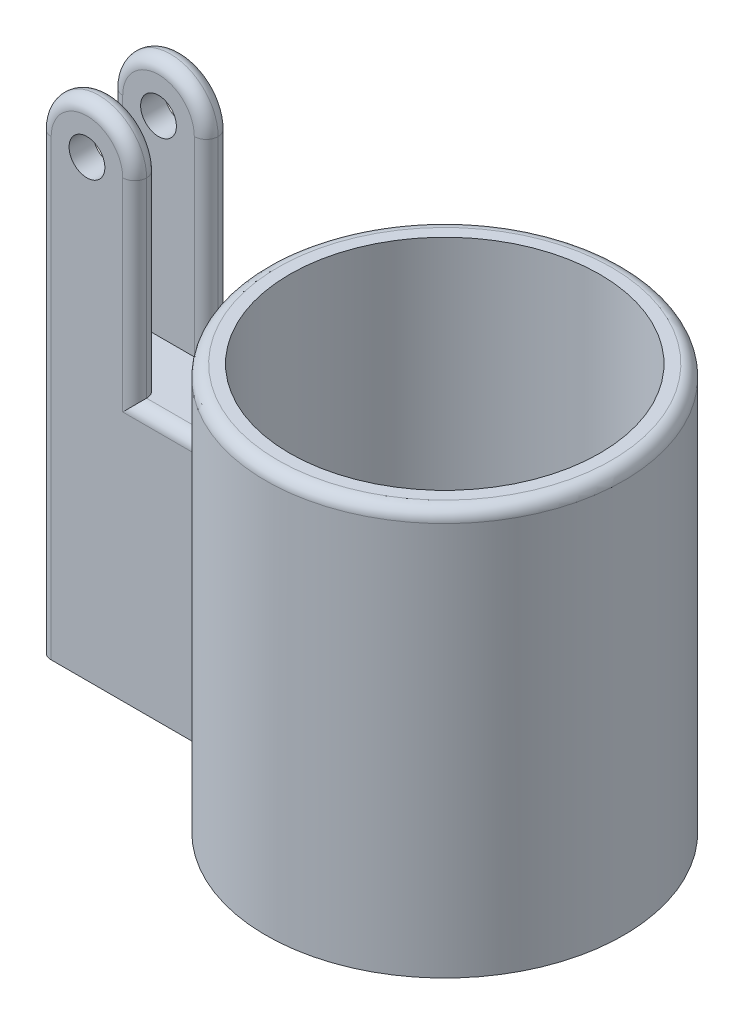
ISO-10303-21;
HEADER;
FILE_DESCRIPTION(('STEP AP214'),'2;1');
FILE_NAME('part.step','',(''),(''),'','','');
FILE_SCHEMA(('AUTOMOTIVE_DESIGN { 1 0 10303 214 1 1 1 1 }'));
ENDSEC;
DATA;
#1=APPLICATION_CONTEXT('core data for automotive mechanical design processes');
#2=APPLICATION_PROTOCOL_DEFINITION('international standard','automotive_design',2000,#1);
#3=PRODUCT_CONTEXT('',#1,'mechanical');
#4=PRODUCT('Part','Part','',(#3));
#5=PRODUCT_RELATED_PRODUCT_CATEGORY('part','',(#4));
#6=PRODUCT_DEFINITION_FORMATION('','',#4);
#7=PRODUCT_DEFINITION_CONTEXT('part definition',#1,'design');
#8=PRODUCT_DEFINITION('design','',#6,#7);
#9=PRODUCT_DEFINITION_SHAPE('','',#8);
#10=(LENGTH_UNIT() NAMED_UNIT(*) SI_UNIT(.MILLI.,.METRE.));
#11=(NAMED_UNIT(*) PLANE_ANGLE_UNIT() SI_UNIT($,.RADIAN.));
#12=(NAMED_UNIT(*) SI_UNIT($,.STERADIAN.) SOLID_ANGLE_UNIT());
#13=UNCERTAINTY_MEASURE_WITH_UNIT(LENGTH_MEASURE(1.E-05),#10,'distance_accuracy_value','');
#14=(GEOMETRIC_REPRESENTATION_CONTEXT(3) GLOBAL_UNCERTAINTY_ASSIGNED_CONTEXT((#13)) GLOBAL_UNIT_ASSIGNED_CONTEXT((#10,
#11,#12)) REPRESENTATION_CONTEXT('',''));
#15=CARTESIAN_POINT('',(0.,0.,0.));
#16=DIRECTION('',(0.,0.,1.));
#17=DIRECTION('',(1.,0.,0.));
#18=AXIS2_PLACEMENT_3D('',#15,#16,#17);
#19=CARTESIAN_POINT('',(-15.,-1.,2.));
#20=DIRECTION('',(0.,0.,-1.));
#21=DIRECTION('',(-1.,0.,0.));
#22=AXIS2_PLACEMENT_3D('',#19,#20,#21);
#23=PLANE('',#22);
#24=DIRECTION('',(0.,1.,0.));
#25=VECTOR('',#24,1.);
#26=CARTESIAN_POINT('',(-7.22841614740048,-1.,2.));
#27=LINE('',#26,#25);
#28=CARTESIAN_POINT('',(-7.22841614740048,-1.,2.));
#29=VERTEX_POINT('',#28);
#30=CARTESIAN_POINT('',(-7.22841614740048,9.5,2.));
#31=VERTEX_POINT('',#30);
#32=EDGE_CURVE('E227',#29,#31,#27,.T.);
#33=ORIENTED_EDGE('',*,*,#32,.T.);
#34=DIRECTION('',(1.,0.,0.));
#35=VECTOR('',#34,1.);
#36=CARTESIAN_POINT('',(-11.5,9.5,2.));
#37=LINE('',#36,#35);
#38=CARTESIAN_POINT('',(-11.5,9.5,2.));
#39=VERTEX_POINT('',#38);
#40=EDGE_CURVE('E357',#31,#39,#37,.F.);
#41=ORIENTED_EDGE('',*,*,#40,.T.);
#42=DIRECTION('',(0.,-1.,0.));
#43=VECTOR('',#42,1.);
#44=CARTESIAN_POINT('',(-11.5,18.,2.));
#45=LINE('',#44,#43);
#46=CARTESIAN_POINT('',(-11.5,18.,2.));
#47=VERTEX_POINT('',#46);
#48=EDGE_CURVE('E100',#39,#47,#45,.F.);
#49=ORIENTED_EDGE('',*,*,#48,.T.);
#50=CARTESIAN_POINT('',(-13.,18.,2.));
#51=DIRECTION('',(0.,0.,-1.));
#52=DIRECTION('',(-1.,0.,0.));
#53=AXIS2_PLACEMENT_3D('',#50,#51,#52);
#54=CIRCLE('',#53,1.5);
#55=CARTESIAN_POINT('',(-14.5,18.,2.));
#56=VERTEX_POINT('',#55);
#57=EDGE_CURVE('E290',#47,#56,#54,.F.);
#58=ORIENTED_EDGE('',*,*,#57,.T.);
#59=DIRECTION('',(0.,1.,0.));
#60=VECTOR('',#59,1.);
#61=CARTESIAN_POINT('',(-14.5,-1.,2.));
#62=LINE('',#61,#60);
#63=CARTESIAN_POINT('',(-14.5,-1.,2.));
#64=VERTEX_POINT('',#63);
#65=EDGE_CURVE('E292',#56,#64,#62,.F.);
#66=ORIENTED_EDGE('',*,*,#65,.T.);
#67=DIRECTION('',(-1.,0.,0.));
#68=VECTOR('',#67,1.);
#69=CARTESIAN_POINT('',(-15.,-1.,2.));
#70=LINE('',#69,#68);
#71=EDGE_CURVE('E233',#29,#64,#70,.T.);
#72=ORIENTED_EDGE('',*,*,#71,.F.);
#73=EDGE_LOOP('',(#33,#41,#49,#58,#66,#72));
#74=FACE_BOUND('',#73,.T.);
#75=CARTESIAN_POINT('',(-13.,18.,2.));
#76=DIRECTION('',(0.,0.,1.));
#77=DIRECTION('',(1.,0.,0.));
#78=AXIS2_PLACEMENT_3D('',#75,#76,#77);
#79=CIRCLE('',#78,0.75);
#80=CARTESIAN_POINT('',(-12.25,18.,2.));
#81=VERTEX_POINT('',#80);
#82=EDGE_CURVE('E255',#81,#81,#79,.T.);
#83=ORIENTED_EDGE('',*,*,#82,.F.);
#84=EDGE_LOOP('',(#83));
#85=FACE_BOUND('',#84,.T.);
#86=ADVANCED_FACE('F77',(#74,#85),#23,.F.);
#87=CARTESIAN_POINT('',(0.,20.,-0.999999999999998));
#88=DIRECTION('',(0.,0.,-1.));
#89=DIRECTION('',(-1.,0.,0.));
#90=AXIS2_PLACEMENT_3D('',#87,#88,#89);
#91=PLANE('',#90);
#92=CARTESIAN_POINT('',(-13.,18.,-0.999999999999997));
#93=DIRECTION('',(0.,0.,-1.));
#94=DIRECTION('',(-1.,0.,0.));
#95=AXIS2_PLACEMENT_3D('',#92,#93,#94);
#96=CIRCLE('',#95,0.75);
#97=CARTESIAN_POINT('',(-13.75,18.,-0.999999999999997));
#98=VERTEX_POINT('',#97);
#99=EDGE_CURVE('E250',#98,#98,#96,.T.);
#100=ORIENTED_EDGE('',*,*,#99,.T.);
#101=EDGE_LOOP('',(#100));
#102=FACE_BOUND('',#101,.T.);
#103=CARTESIAN_POINT('',(-13.,18.,-0.999999999999998));
#104=DIRECTION('',(0.,0.,-1.));
#105=DIRECTION('',(-1.,0.,0.));
#106=AXIS2_PLACEMENT_3D('',#103,#104,#105);
#107=CIRCLE('',#106,1.5);
#108=CARTESIAN_POINT('',(-11.5,18.,-0.999999999999998));
#109=VERTEX_POINT('',#108);
#110=CARTESIAN_POINT('',(-14.5,18.,-0.999999999999998));
#111=VERTEX_POINT('',#110);
#112=EDGE_CURVE('E276',#109,#111,#107,.F.);
#113=ORIENTED_EDGE('',*,*,#112,.T.);
#114=DIRECTION('',(0.,-1.,0.));
#115=VECTOR('',#114,1.);
#116=CARTESIAN_POINT('',(-14.5,20.,-0.999999999999998));
#117=LINE('',#116,#115);
#118=CARTESIAN_POINT('',(-14.5,10.,-0.999999999999998));
#119=VERTEX_POINT('',#118);
#120=EDGE_CURVE('E280',#111,#119,#117,.T.);
#121=ORIENTED_EDGE('',*,*,#120,.T.);
#122=DIRECTION('',(-1.,0.,0.));
#123=VECTOR('',#122,1.);
#124=CARTESIAN_POINT('',(0.,10.,-0.999999999999998));
#125=LINE('',#124,#123);
#126=CARTESIAN_POINT('',(-11.5,10.,-0.999999999999998));
#127=VERTEX_POINT('',#126);
#128=EDGE_CURVE('E249',#127,#119,#125,.T.);
#129=ORIENTED_EDGE('',*,*,#128,.F.);
#130=DIRECTION('',(0.,-1.,0.));
#131=VECTOR('',#130,1.);
#132=CARTESIAN_POINT('',(-11.5,18.,-0.999999999999998));
#133=LINE('',#132,#131);
#134=EDGE_CURVE('E278',#127,#109,#133,.F.);
#135=ORIENTED_EDGE('',*,*,#134,.T.);
#136=EDGE_LOOP('',(#113,#121,#129,#135));
#137=FACE_BOUND('',#136,.T.);
#138=ADVANCED_FACE('F420',(#102,#137),#91,.F.);
#139=CARTESIAN_POINT('',(0.,20.,-2.));
#140=DIRECTION('',(0.,0.,-1.));
#141=DIRECTION('',(-1.,0.,0.));
#142=AXIS2_PLACEMENT_3D('',#139,#140,#141);
#143=PLANE('',#142);
#144=DIRECTION('',(1.,0.,0.));
#145=VECTOR('',#144,1.);
#146=CARTESIAN_POINT('',(0.,0.,-2.));
#147=LINE('',#146,#145);
#148=CARTESIAN_POINT('',(-14.5,0.,-2.));
#149=VERTEX_POINT('',#148);
#150=CARTESIAN_POINT('',(-11.5,0.,-2.));
#151=VERTEX_POINT('',#150);
#152=EDGE_CURVE('E241',#149,#151,#147,.T.);
#153=ORIENTED_EDGE('',*,*,#152,.F.);
#154=DIRECTION('',(0.,-1.,0.));
#155=VECTOR('',#154,1.);
#156=CARTESIAN_POINT('',(-14.5,18.,-2.));
#157=LINE('',#156,#155);
#158=CARTESIAN_POINT('',(-14.5,18.,-2.));
#159=VERTEX_POINT('',#158);
#160=EDGE_CURVE('E274',#149,#159,#157,.F.);
#161=ORIENTED_EDGE('',*,*,#160,.T.);
#162=CARTESIAN_POINT('',(-13.,18.,-2.));
#163=DIRECTION('',(0.,0.,-1.));
#164=DIRECTION('',(-1.,0.,0.));
#165=AXIS2_PLACEMENT_3D('',#162,#163,#164);
#166=CIRCLE('',#165,1.5);
#167=CARTESIAN_POINT('',(-11.5,18.,-2.));
#168=VERTEX_POINT('',#167);
#169=EDGE_CURVE('E270',#159,#168,#166,.T.);
#170=ORIENTED_EDGE('',*,*,#169,.T.);
#171=DIRECTION('',(0.,-1.,0.));
#172=VECTOR('',#171,1.);
#173=CARTESIAN_POINT('',(-11.5,20.,-2.));
#174=LINE('',#173,#172);
#175=EDGE_CURVE('E272',#168,#151,#174,.T.);
#176=ORIENTED_EDGE('',*,*,#175,.T.);
#177=EDGE_LOOP('',(#153,#161,#170,#176));
#178=FACE_BOUND('',#177,.T.);
#179=CARTESIAN_POINT('',(-13.,18.,-2.));
#180=DIRECTION('',(0.,0.,-1.));
#181=DIRECTION('',(-1.,0.,0.));
#182=AXIS2_PLACEMENT_3D('',#179,#180,#181);
#183=CIRCLE('',#182,0.75);
#184=CARTESIAN_POINT('',(-13.75,18.,-2.));
#185=VERTEX_POINT('',#184);
#186=EDGE_CURVE('E254',#185,#185,#183,.T.);
#187=ORIENTED_EDGE('',*,*,#186,.F.);
#188=EDGE_LOOP('',(#187));
#189=FACE_BOUND('',#188,.T.);
#190=ADVANCED_FACE('F426',(#178,#189),#143,.T.);
#191=CARTESIAN_POINT('',(0.,20.,1.));
#192=DIRECTION('',(0.,0.,1.));
#193=DIRECTION('',(1.,0.,0.));
#194=AXIS2_PLACEMENT_3D('',#191,#192,#193);
#195=PLANE('',#194);
#196=CARTESIAN_POINT('',(-13.,18.,1.));
#197=DIRECTION('',(0.,0.,1.));
#198=DIRECTION('',(1.,0.,0.));
#199=AXIS2_PLACEMENT_3D('',#196,#197,#198);
#200=CIRCLE('',#199,0.75);
#201=CARTESIAN_POINT('',(-12.25,18.,1.));
#202=VERTEX_POINT('',#201);
#203=EDGE_CURVE('E251',#202,#202,#200,.T.);
#204=ORIENTED_EDGE('',*,*,#203,.T.);
#205=EDGE_LOOP('',(#204));
#206=FACE_BOUND('',#205,.T.);
#207=CARTESIAN_POINT('',(-13.,18.,1.));
#208=DIRECTION('',(0.,0.,1.));
#209=DIRECTION('',(1.,0.,0.));
#210=AXIS2_PLACEMENT_3D('',#207,#208,#209);
#211=CIRCLE('',#210,1.5);
#212=CARTESIAN_POINT('',(-14.5,18.,1.));
#213=VERTEX_POINT('',#212);
#214=CARTESIAN_POINT('',(-11.5,18.,1.));
#215=VERTEX_POINT('',#214);
#216=EDGE_CURVE('E283',#213,#215,#211,.F.);
#217=ORIENTED_EDGE('',*,*,#216,.T.);
#218=DIRECTION('',(0.,-1.,0.));
#219=VECTOR('',#218,1.);
#220=CARTESIAN_POINT('',(-11.5,10.,1.));
#221=LINE('',#220,#219);
#222=CARTESIAN_POINT('',(-11.5,10.,1.));
#223=VERTEX_POINT('',#222);
#224=EDGE_CURVE('E287',#215,#223,#221,.T.);
#225=ORIENTED_EDGE('',*,*,#224,.T.);
#226=DIRECTION('',(1.,0.,0.));
#227=VECTOR('',#226,1.);
#228=CARTESIAN_POINT('',(0.,10.,1.));
#229=LINE('',#228,#227);
#230=CARTESIAN_POINT('',(-14.5,10.,1.));
#231=VERTEX_POINT('',#230);
#232=EDGE_CURVE('E483',#231,#223,#229,.T.);
#233=ORIENTED_EDGE('',*,*,#232,.F.);
#234=DIRECTION('',(0.,-1.,0.));
#235=VECTOR('',#234,1.);
#236=CARTESIAN_POINT('',(-14.5,20.,1.));
#237=LINE('',#236,#235);
#238=EDGE_CURVE('E285',#231,#213,#237,.F.);
#239=ORIENTED_EDGE('',*,*,#238,.T.);
#240=EDGE_LOOP('',(#217,#225,#233,#239));
#241=FACE_BOUND('',#240,.T.);
#242=ADVANCED_FACE('F440',(#206,#241),#195,.F.);
#243=CARTESIAN_POINT('',(-15.,-1.,2.));
#244=DIRECTION('',(1.,0.,0.));
#245=DIRECTION('',(0.,0.,-1.));
#246=AXIS2_PLACEMENT_3D('',#243,#244,#245);
#247=PLANE('',#246);
#248=DIRECTION('',(0.,1.,0.));
#249=VECTOR('',#248,1.);
#250=CARTESIAN_POINT('',(-15.,-1.,1.5));
#251=LINE('',#250,#249);
#252=CARTESIAN_POINT('',(-15.,-1.,1.5));
#253=VERTEX_POINT('',#252);
#254=CARTESIAN_POINT('',(-15.,9.5,1.5));
#255=VERTEX_POINT('',#254);
#256=EDGE_CURVE('E245',#253,#255,#251,.T.);
#257=ORIENTED_EDGE('',*,*,#256,.T.);
#258=DIRECTION('',(0.,0.,1.));
#259=VECTOR('',#258,1.);
#260=CARTESIAN_POINT('',(-15.,9.5,-1.5));
#261=LINE('',#260,#259);
#262=CARTESIAN_POINT('',(-15.,9.5,-1.5));
#263=VERTEX_POINT('',#262);
#264=EDGE_CURVE('E354',#255,#263,#261,.F.);
#265=ORIENTED_EDGE('',*,*,#264,.T.);
#266=DIRECTION('',(0.,-1.,0.));
#267=VECTOR('',#266,1.);
#268=CARTESIAN_POINT('',(-15.,0.,-1.5));
#269=LINE('',#268,#267);
#270=CARTESIAN_POINT('',(-15.,-1.,-1.5));
#271=VERTEX_POINT('',#270);
#272=EDGE_CURVE('E258',#263,#271,#269,.T.);
#273=ORIENTED_EDGE('',*,*,#272,.T.);
#274=DIRECTION('',(0.,0.,-1.));
#275=VECTOR('',#274,1.);
#276=CARTESIAN_POINT('',(-15.,-1.,2.));
#277=LINE('',#276,#275);
#278=EDGE_CURVE('E216',#253,#271,#277,.T.);
#279=ORIENTED_EDGE('',*,*,#278,.F.);
#280=EDGE_LOOP('',(#257,#265,#273,#279));
#281=FACE_BOUND('',#280,.T.);
#282=ADVANCED_FACE('F437',(#281),#247,.F.);
#283=CARTESIAN_POINT('',(0.,20.,0.));
#284=DIRECTION('',(0.,-1.,0.));
#285=DIRECTION('',(0.,0.,-1.));
#286=AXIS2_PLACEMENT_3D('',#283,#284,#285);
#287=CYLINDRICAL_SURFACE('',#286,7.5);
#288=CARTESIAN_POINT('',(0.,15.5,0.));
#289=DIRECTION('',(0.,-1.,0.));
#290=DIRECTION('',(0.,0.,-1.));
#291=AXIS2_PLACEMENT_3D('',#288,#289,#290);
#292=CIRCLE('',#291,7.5);
#293=CARTESIAN_POINT('',(0.,15.5,-7.5));
#294=VERTEX_POINT('',#293);
#295=EDGE_CURVE('E295',#294,#294,#292,.T.);
#296=ORIENTED_EDGE('',*,*,#295,.T.);
#297=EDGE_LOOP('',(#296));
#298=FACE_BOUND('',#297,.T.);
#299=CARTESIAN_POINT('',(0.,10.,0.));
#300=DIRECTION('',(0.,1.,0.));
#301=DIRECTION('',(0.,0.,1.));
#302=AXIS2_PLACEMENT_3D('',#299,#300,#301);
#303=CIRCLE('',#302,7.5);
#304=CARTESIAN_POINT('',(-7.34846922834953,10.,1.5));
#305=VERTEX_POINT('',#304);
#306=CARTESIAN_POINT('',(-7.35638266874421,10.,-1.46069641986273));
#307=VERTEX_POINT('',#306);
#308=EDGE_CURVE('E475',#305,#307,#303,.F.);
#309=ORIENTED_EDGE('',*,*,#308,.F.);
#310=CARTESIAN_POINT('',(-7.34846922834953,10.,1.5));
#311=CARTESIAN_POINT('',(-7.34260158815118,10.0000204172795,1.52877840285499));
#312=CARTESIAN_POINT('',(-7.33655418831696,9.99751684241223,1.5575098373988));
#313=CARTESIAN_POINT('',(-7.32431268980203,9.98765162880123,1.6140800495042));
#314=CARTESIAN_POINT('',(-7.31811866566813,9.9802924097076,1.6419192644325));
#315=CARTESIAN_POINT('',(-7.30578825199919,9.96090197371145,1.69594629144679));
#316=CARTESIAN_POINT('',(-7.29965188408316,9.94886907074739,1.72213350359452));
#317=CARTESIAN_POINT('',(-7.28768141863653,9.92045692079562,1.77210562944244));
#318=CARTESIAN_POINT('',(-7.28184726971984,9.90407841560604,1.79589095219147));
#319=CARTESIAN_POINT('',(-7.27074987429325,9.86744963242031,1.84030436159788));
#320=CARTESIAN_POINT('',(-7.26548504101553,9.84721057426438,1.8609412929956));
#321=CARTESIAN_POINT('',(-7.25576064465369,9.80336139877773,1.89850331183888));
#322=CARTESIAN_POINT('',(-7.25130115735584,9.77975096456107,1.91542804998437));
#323=CARTESIAN_POINT('',(-7.24352093771607,9.73042724895512,1.94464092872137));
#324=CARTESIAN_POINT('',(-7.24017551852059,9.70477777468493,1.9570302904944));
#325=CARTESIAN_POINT('',(-7.23466798769301,9.65164701492667,1.97729372895358));
#326=CARTESIAN_POINT('',(-7.2325045939994,9.62416775053725,1.98517269819611));
#327=CARTESIAN_POINT('',(-7.23013980010958,9.58037430852398,1.99376234444672));
#328=CARTESIAN_POINT('',(-7.22949441511994,9.56438556442295,1.99609988323275));
#329=CARTESIAN_POINT('',(-7.22863246521098,9.53226730533624,1.99921826842528));
#330=CARTESIAN_POINT('',(-7.22841532601774,9.51613800804292,2.00000119955687));
#331=CARTESIAN_POINT('',(-7.22841614740048,9.5,2.));
#332=B_SPLINE_CURVE_WITH_KNOTS('',3,(#310,#311,#312,#313,#314,#315,#316,#317,#318,#319,#320,
#321,#322,#323,#324,#325,#326,#327,#328,#329,#330,#331),.UNSPECIFIED.,.F.,.F.,(4,2,2,2,2,2,2,2,
2,2,4),(0.,0.0879905534558804,0.175937292805017,0.263915789019254,0.351879276878124,
0.439590909658535,0.527310792157074,0.612932471579488,0.698461097779793,0.746902707122689,
0.795279312395451),.UNSPECIFIED.);
#333=EDGE_CURVE('E86',#305,#31,#332,.T.);
#334=ORIENTED_EDGE('',*,*,#333,.T.);
#335=ORIENTED_EDGE('',*,*,#32,.F.);
#336=CARTESIAN_POINT('',(0.,-1.,0.));
#337=DIRECTION('',(0.,-1.,0.));
#338=DIRECTION('',(0.,0.,-1.));
#339=AXIS2_PLACEMENT_3D('',#336,#337,#338);
#340=CIRCLE('',#339,7.5);
#341=CARTESIAN_POINT('',(-7.23917602694792,-1.,-1.96069641986273));
#342=VERTEX_POINT('',#341);
#343=EDGE_CURVE('E210',#342,#29,#340,.T.);
#344=ORIENTED_EDGE('',*,*,#343,.F.);
#345=DIRECTION('',(0.,1.,0.));
#346=VECTOR('',#345,1.);
#347=CARTESIAN_POINT('',(-7.23917602694792,-1.,-1.96069641986273));
#348=LINE('',#347,#346);
#349=CARTESIAN_POINT('',(-7.23917602694792,9.5,-1.96069641986273));
#350=VERTEX_POINT('',#349);
#351=EDGE_CURVE('E219',#342,#350,#348,.T.);
#352=ORIENTED_EDGE('',*,*,#351,.T.);
#353=CARTESIAN_POINT('',(-7.23917602694792,9.5,-1.96069641986273));
#354=CARTESIAN_POINT('',(-7.23916432362115,9.52747668330952,-1.9607231467335));
#355=CARTESIAN_POINT('',(-7.23978893539414,9.55493907143122,-1.95843329507881));
#356=CARTESIAN_POINT('',(-7.24222175422741,9.60902264720567,-1.94942626244312));
#357=CARTESIAN_POINT('',(-7.24402771573558,9.63564533056132,-1.94271748095544));
#358=CARTESIAN_POINT('',(-7.24873496527142,9.68734844636092,-1.92507644728343));
#359=CARTESIAN_POINT('',(-7.2516363229489,9.712428780618,-1.9141439265353));
#360=CARTESIAN_POINT('',(-7.25837959211925,9.76038205654802,-1.88841286626802));
#361=CARTESIAN_POINT('',(-7.2622216513563,9.78325465069142,-1.87361371944194));
#362=CARTESIAN_POINT('',(-7.27073405602892,9.82658272821175,-1.84030583419795));
#363=CARTESIAN_POINT('',(-7.27541746606841,9.84699007890537,-1.82173787717084));
#364=CARTESIAN_POINT('',(-7.28535343386889,9.88442538262351,-1.78158708729993));
#365=CARTESIAN_POINT('',(-7.29060615109066,9.90145238502397,-1.76000340927207));
#366=CARTESIAN_POINT('',(-7.3016318501661,9.93218884800588,-1.71369643336603));
#367=CARTESIAN_POINT('',(-7.30741593533396,9.94577858369398,-1.6888963361508));
#368=CARTESIAN_POINT('',(-7.31912757837347,9.96858233761452,-1.63739662210629));
#369=CARTESIAN_POINT('',(-7.3250550837241,9.97779793292854,-1.6106976938924));
#370=CARTESIAN_POINT('',(-7.33527340894829,9.98977719467495,-1.5633885652755));
#371=CARTESIAN_POINT('',(-7.33958081158357,9.99360436836874,-1.54304449574445));
#372=CARTESIAN_POINT('',(-7.34808247666647,9.99871617808414,-1.50204123668613));
#373=CARTESIAN_POINT('',(-7.3522768636617,10.0000037362256,-1.481382436918));
#374=CARTESIAN_POINT('',(-7.35638266874421,10.,-1.46069641986273));
#375=B_SPLINE_CURVE_WITH_KNOTS('',3,(#353,#354,#355,#356,#357,#358,#359,#360,#361,#362,#363,
#364,#365,#366,#367,#368,#369,#370,#371,#372,#373,#374),.UNSPECIFIED.,.F.,.F.,(4,2,2,2,2,2,2,2,
2,2,4),(0.,0.0823059147960208,0.164455832398586,0.246610974311693,0.328779027587685,
0.412355028109165,0.495954498746016,0.582155453445405,0.668325305028135,0.731609882726471,
0.79482160166144),.UNSPECIFIED.);
#376=EDGE_CURVE('E449',#350,#307,#375,.T.);
#377=ORIENTED_EDGE('',*,*,#376,.T.);
#378=EDGE_LOOP('',(#309,#334,#335,#344,#352,#377));
#379=FACE_BOUND('',#378,.T.);
#380=ADVANCED_FACE('F230',(#298,#379),#287,.T.);
#381=CARTESIAN_POINT('',(0.,-1.,0.));
#382=DIRECTION('',(0.,-1.,0.));
#383=DIRECTION('',(0.,0.,-1.));
#384=AXIS2_PLACEMENT_3D('',#381,#382,#383);
#385=PLANE('',#384);
#386=ORIENTED_EDGE('',*,*,#278,.T.);
#387=CARTESIAN_POINT('',(-14.5,-1.,-1.5));
#388=DIRECTION('',(0.,-1.,0.));
#389=DIRECTION('',(0.,0.,-1.));
#390=AXIS2_PLACEMENT_3D('',#387,#388,#389);
#391=CIRCLE('',#390,0.5);
#392=CARTESIAN_POINT('',(-14.6943162595504,-1.,-1.96069641986273));
#393=VERTEX_POINT('',#392);
#394=EDGE_CURVE('E213',#271,#393,#391,.T.);
#395=ORIENTED_EDGE('',*,*,#394,.T.);
#396=DIRECTION('',(1.,0.,0.));
#397=VECTOR('',#396,1.);
#398=CARTESIAN_POINT('',(-15.,-1.,-1.96069641986273));
#399=LINE('',#398,#397);
#400=EDGE_CURVE('E204',#393,#342,#399,.T.);
#401=ORIENTED_EDGE('',*,*,#400,.T.);
#402=ORIENTED_EDGE('',*,*,#343,.T.);
#403=ORIENTED_EDGE('',*,*,#71,.T.);
#404=CARTESIAN_POINT('',(-14.5,-1.,1.5));
#405=DIRECTION('',(0.,-1.,0.));
#406=DIRECTION('',(0.,0.,-1.));
#407=AXIS2_PLACEMENT_3D('',#404,#405,#406);
#408=CIRCLE('',#407,0.5);
#409=EDGE_CURVE('E261',#64,#253,#408,.T.);
#410=ORIENTED_EDGE('',*,*,#409,.T.);
#411=EDGE_LOOP('',(#386,#395,#401,#402,#403,#410));
#412=FACE_BOUND('',#411,.T.);
#413=ADVANCED_FACE('F207',(#412),#385,.T.);
#414=CARTESIAN_POINT('',(-15.,-1.,-1.96069641986273));
#415=DIRECTION('',(0.,0.,1.));
#416=DIRECTION('',(1.,0.,0.));
#417=AXIS2_PLACEMENT_3D('',#414,#415,#416);
#418=PLANE('',#417);
#419=DIRECTION('',(0.,-1.,0.));
#420=VECTOR('',#419,1.);
#421=CARTESIAN_POINT('',(-11.3056837404496,0.,-1.96069641986273));
#422=LINE('',#421,#420);
#423=CARTESIAN_POINT('',(-11.3056837404496,0.,-1.96069641986273));
#424=VERTEX_POINT('',#423);
#425=CARTESIAN_POINT('',(-11.3056837404496,9.5,-1.96069641986273));
#426=VERTEX_POINT('',#425);
#427=EDGE_CURVE('E301',#424,#426,#422,.F.);
#428=ORIENTED_EDGE('',*,*,#427,.T.);
#429=DIRECTION('',(-1.,0.,0.));
#430=VECTOR('',#429,1.);
#431=CARTESIAN_POINT('',(-7.23917602694792,9.5,-1.96069641986273));
#432=LINE('',#431,#430);
#433=EDGE_CURVE('E223',#426,#350,#432,.F.);
#434=ORIENTED_EDGE('',*,*,#433,.T.);
#435=ORIENTED_EDGE('',*,*,#351,.F.);
#436=ORIENTED_EDGE('',*,*,#400,.F.);
#437=DIRECTION('',(0.,1.,0.));
#438=VECTOR('',#437,1.);
#439=CARTESIAN_POINT('',(-14.6943162595504,-1.,-1.96069641986273));
#440=LINE('',#439,#438);
#441=CARTESIAN_POINT('',(-14.6943162595504,0.,-1.96069641986273));
#442=VERTEX_POINT('',#441);
#443=EDGE_CURVE('E264',#393,#442,#440,.T.);
#444=ORIENTED_EDGE('',*,*,#443,.T.);
#445=DIRECTION('',(1.,0.,0.));
#446=VECTOR('',#445,1.);
#447=CARTESIAN_POINT('',(-15.,0.,-1.96069641986273));
#448=LINE('',#447,#446);
#449=EDGE_CURVE('E238',#442,#424,#448,.T.);
#450=ORIENTED_EDGE('',*,*,#449,.T.);
#451=EDGE_LOOP('',(#428,#434,#435,#436,#444,#450));
#452=FACE_BOUND('',#451,.T.);
#453=ADVANCED_FACE('F221',(#452),#418,.F.);
#454=CARTESIAN_POINT('',(0.,0.,0.));
#455=DIRECTION('',(0.,1.,0.));
#456=DIRECTION('',(0.,0.,1.));
#457=AXIS2_PLACEMENT_3D('',#454,#455,#456);
#458=PLANE('',#457);
#459=ORIENTED_EDGE('',*,*,#449,.F.);
#460=CARTESIAN_POINT('',(-14.5,0.,-1.5));
#461=DIRECTION('',(0.,1.,0.));
#462=DIRECTION('',(0.,0.,1.));
#463=AXIS2_PLACEMENT_3D('',#460,#461,#462);
#464=CIRCLE('',#463,0.5);
#465=EDGE_CURVE('E268',#442,#149,#464,.F.);
#466=ORIENTED_EDGE('',*,*,#465,.T.);
#467=ORIENTED_EDGE('',*,*,#152,.T.);
#468=CARTESIAN_POINT('',(-11.5,0.,-1.5));
#469=DIRECTION('',(0.,1.,0.));
#470=DIRECTION('',(0.,0.,1.));
#471=AXIS2_PLACEMENT_3D('',#468,#469,#470);
#472=CIRCLE('',#471,0.5);
#473=EDGE_CURVE('E266',#151,#424,#472,.F.);
#474=ORIENTED_EDGE('',*,*,#473,.T.);
#475=EDGE_LOOP('',(#459,#466,#467,#474));
#476=FACE_BOUND('',#475,.T.);
#477=ADVANCED_FACE('F436',(#476),#458,.F.);
#478=CARTESIAN_POINT('',(0.,10.,0.));
#479=DIRECTION('',(0.,1.,0.));
#480=DIRECTION('',(0.,0.,1.));
#481=AXIS2_PLACEMENT_3D('',#478,#479,#480);
#482=PLANE('',#481);
#483=ORIENTED_EDGE('',*,*,#308,.T.);
#484=DIRECTION('',(-1.,0.,0.));
#485=VECTOR('',#484,1.);
#486=CARTESIAN_POINT('',(-11.3056837404496,10.,-1.46069641986273));
#487=LINE('',#486,#485);
#488=CARTESIAN_POINT('',(-11.0015471651316,10.,-1.46069641986273));
#489=VERTEX_POINT('',#488);
#490=EDGE_CURVE('E350',#307,#489,#487,.T.);
#491=ORIENTED_EDGE('',*,*,#490,.T.);
#492=CARTESIAN_POINT('',(-11.5,10.,-1.5));
#493=DIRECTION('',(0.,1.,0.));
#494=DIRECTION('',(0.,0.,1.));
#495=AXIS2_PLACEMENT_3D('',#492,#493,#494);
#496=CIRCLE('',#495,0.5);
#497=EDGE_CURVE('E303',#489,#127,#496,.F.);
#498=ORIENTED_EDGE('',*,*,#497,.T.);
#499=ORIENTED_EDGE('',*,*,#128,.T.);
#500=DIRECTION('',(0.,0.,1.));
#501=VECTOR('',#500,1.);
#502=CARTESIAN_POINT('',(-14.5,10.,1.5));
#503=LINE('',#502,#501);
#504=EDGE_CURVE('E347',#119,#231,#503,.T.);
#505=ORIENTED_EDGE('',*,*,#504,.T.);
#506=ORIENTED_EDGE('',*,*,#232,.T.);
#507=CARTESIAN_POINT('',(-11.5,10.,1.5));
#508=DIRECTION('',(0.,1.,0.));
#509=DIRECTION('',(0.,0.,1.));
#510=AXIS2_PLACEMENT_3D('',#507,#508,#509);
#511=CIRCLE('',#510,0.5);
#512=CARTESIAN_POINT('',(-11.,10.,1.5));
#513=VERTEX_POINT('',#512);
#514=EDGE_CURVE('E305',#223,#513,#511,.F.);
#515=ORIENTED_EDGE('',*,*,#514,.T.);
#516=DIRECTION('',(1.,0.,0.));
#517=VECTOR('',#516,1.);
#518=CARTESIAN_POINT('',(-7.22841614740048,10.,1.5));
#519=LINE('',#518,#517);
#520=EDGE_CURVE('E308',#513,#305,#519,.T.);
#521=ORIENTED_EDGE('',*,*,#520,.T.);
#522=EDGE_LOOP('',(#483,#491,#498,#499,#505,#506,#515,#521));
#523=FACE_BOUND('',#522,.T.);
#524=ADVANCED_FACE('F472',(#523),#482,.T.);
#525=CARTESIAN_POINT('',(-7.5,16.,-8.));
#526=DIRECTION('',(0.,-1.,0.));
#527=DIRECTION('',(0.,0.,-1.));
#528=AXIS2_PLACEMENT_3D('',#525,#526,#527);
#529=PLANE('',#528);
#530=CARTESIAN_POINT('',(0.,16.,0.));
#531=DIRECTION('',(0.,-1.,0.));
#532=DIRECTION('',(0.,0.,-1.));
#533=AXIS2_PLACEMENT_3D('',#530,#531,#532);
#534=CIRCLE('',#533,7.);
#535=CARTESIAN_POINT('',(0.,16.,-7.));
#536=VERTEX_POINT('',#535);
#537=EDGE_CURVE('E298',#536,#536,#534,.F.);
#538=ORIENTED_EDGE('',*,*,#537,.T.);
#539=EDGE_LOOP('',(#538));
#540=FACE_BOUND('',#539,.T.);
#541=CARTESIAN_POINT('',(0.,16.,0.));
#542=DIRECTION('',(0.,-1.,0.));
#543=DIRECTION('',(0.,0.,-1.));
#544=AXIS2_PLACEMENT_3D('',#541,#542,#543);
#545=CIRCLE('',#544,6.5);
#546=CARTESIAN_POINT('',(0.,16.,-6.5));
#547=VERTEX_POINT('',#546);
#548=EDGE_CURVE('E246',#547,#547,#545,.T.);
#549=ORIENTED_EDGE('',*,*,#548,.T.);
#550=EDGE_LOOP('',(#549));
#551=FACE_BOUND('',#550,.T.);
#552=ADVANCED_FACE('F570',(#540,#551),#529,.F.);
#553=CARTESIAN_POINT('',(0.,0.,0.));
#554=DIRECTION('',(0.,-1.,0.));
#555=DIRECTION('',(0.,0.,-1.));
#556=AXIS2_PLACEMENT_3D('',#553,#554,#555);
#557=PLANE('',#556);
#558=CARTESIAN_POINT('',(0.,0.,0.));
#559=DIRECTION('',(0.,1.,0.));
#560=DIRECTION('',(0.,0.,1.));
#561=AXIS2_PLACEMENT_3D('',#558,#559,#560);
#562=CIRCLE('',#561,6.5);
#563=CARTESIAN_POINT('',(0.,0.,6.5));
#564=VERTEX_POINT('',#563);
#565=EDGE_CURVE('E226',#564,#564,#562,.T.);
#566=ORIENTED_EDGE('',*,*,#565,.T.);
#567=EDGE_LOOP('',(#566));
#568=FACE_BOUND('',#567,.T.);
#569=ADVANCED_FACE('F432',(#568),#557,.F.);
#570=CARTESIAN_POINT('',(0.,20.,0.));
#571=DIRECTION('',(0.,-1.,0.));
#572=DIRECTION('',(0.,0.,-1.));
#573=AXIS2_PLACEMENT_3D('',#570,#571,#572);
#574=CYLINDRICAL_SURFACE('',#573,6.5);
#575=ORIENTED_EDGE('',*,*,#548,.F.);
#576=EDGE_LOOP('',(#575));
#577=FACE_BOUND('',#576,.T.);
#578=ORIENTED_EDGE('',*,*,#565,.F.);
#579=EDGE_LOOP('',(#578));
#580=FACE_BOUND('',#579,.T.);
#581=ADVANCED_FACE('F446',(#577,#580),#574,.F.);
#582=CARTESIAN_POINT('',(-13.,18.,-18.));
#583=DIRECTION('',(0.,0.,1.));
#584=DIRECTION('',(1.,0.,0.));
#585=AXIS2_PLACEMENT_3D('',#582,#583,#584);
#586=CYLINDRICAL_SURFACE('',#585,0.75);
#587=ORIENTED_EDGE('',*,*,#82,.T.);
#588=EDGE_LOOP('',(#587));
#589=FACE_BOUND('',#588,.T.);
#590=ORIENTED_EDGE('',*,*,#203,.F.);
#591=EDGE_LOOP('',(#590));
#592=FACE_BOUND('',#591,.T.);
#593=ADVANCED_FACE('F549',(#589,#592),#586,.F.);
#594=ORIENTED_EDGE('',*,*,#186,.T.);
#595=EDGE_LOOP('',(#594));
#596=FACE_BOUND('',#595,.T.);
#597=ORIENTED_EDGE('',*,*,#99,.F.);
#598=EDGE_LOOP('',(#597));
#599=FACE_BOUND('',#598,.T.);
#600=ADVANCED_FACE('F382',(#596,#599),#586,.F.);
#601=CARTESIAN_POINT('',(-11.5,20.,-1.5));
#602=DIRECTION('',(0.,1.,0.));
#603=DIRECTION('',(0.,0.,1.));
#604=AXIS2_PLACEMENT_3D('',#601,#602,#603);
#605=CYLINDRICAL_SURFACE('',#604,0.5);
#606=ORIENTED_EDGE('',*,*,#134,.F.);
#607=ORIENTED_EDGE('',*,*,#497,.F.);
#608=CARTESIAN_POINT('',(-11.0015471651316,10.,-1.46069641986273));
#609=CARTESIAN_POINT('',(-11.0010311438197,10.0000002996013,-1.46724701655227));
#610=CARTESIAN_POINT('',(-11.0006442027362,9.99987151897431,-1.47379761324182));
#611=CARTESIAN_POINT('',(-11.0001284810257,9.9993557972638,-1.48689880662091));
#612=CARTESIAN_POINT('',(-10.9999997003987,9.99896885618026,-1.49344940331045));
#613=CARTESIAN_POINT('',(-11.,9.99845283486845,-1.5));
#614=B_SPLINE_CURVE_WITH_KNOTS('',3,(#608,#609,#610,#611,#612,#613),.UNSPECIFIED.,.F.,.F.,(4,2,
4),(0.,0.0196898355394316,0.0393796710788632),.UNSPECIFIED.);
#615=CARTESIAN_POINT('',(-11.,9.99845283486859,-1.5));
#616=VERTEX_POINT('',#615);
#617=EDGE_CURVE('E359',#489,#616,#614,.T.);
#618=ORIENTED_EDGE('',*,*,#617,.T.);
#619=DIRECTION('',(0.,-1.,0.));
#620=VECTOR('',#619,1.);
#621=CARTESIAN_POINT('',(-11.,10.,-1.5));
#622=LINE('',#621,#620);
#623=CARTESIAN_POINT('',(-11.,18.,-1.5));
#624=VERTEX_POINT('',#623);
#625=EDGE_CURVE('E93',#624,#616,#622,.T.);
#626=ORIENTED_EDGE('',*,*,#625,.F.);
#627=CARTESIAN_POINT('',(-11.5,18.,-1.5));
#628=DIRECTION('',(0.,1.,0.));
#629=DIRECTION('',(0.,0.,1.));
#630=AXIS2_PLACEMENT_3D('',#627,#628,#629);
#631=CIRCLE('',#630,0.5);
#632=EDGE_CURVE('E322',#109,#624,#631,.T.);
#633=ORIENTED_EDGE('',*,*,#632,.F.);
#634=EDGE_LOOP('',(#606,#607,#618,#626,#633));
#635=FACE_BOUND('',#634,.T.);
#636=ADVANCED_FACE('F377',(#635),#605,.T.);
#637=CARTESIAN_POINT('',(-11.5,20.,-1.5));
#638=DIRECTION('',(0.,-1.,0.));
#639=DIRECTION('',(0.,0.,-1.));
#640=AXIS2_PLACEMENT_3D('',#637,#638,#639);
#641=CYLINDRICAL_SURFACE('',#640,0.5);
#642=ORIENTED_EDGE('',*,*,#473,.F.);
#643=ORIENTED_EDGE('',*,*,#175,.F.);
#644=CARTESIAN_POINT('',(-11.5,18.,-1.5));
#645=DIRECTION('',(0.,1.,0.));
#646=DIRECTION('',(0.,0.,1.));
#647=AXIS2_PLACEMENT_3D('',#644,#645,#646);
#648=CIRCLE('',#647,0.5);
#649=EDGE_CURVE('E319',#624,#168,#648,.T.);
#650=ORIENTED_EDGE('',*,*,#649,.F.);
#651=ORIENTED_EDGE('',*,*,#625,.T.);
#652=CARTESIAN_POINT('',(-11.,9.99845283486859,-1.5));
#653=CARTESIAN_POINT('',(-10.9999643360481,9.99668079675454,-1.52294470955284));
#654=CARTESIAN_POINT('',(-11.0015763562797,9.9932595109544,-1.54568662051951));
#655=CARTESIAN_POINT('',(-11.0076626168216,9.98352445102083,-1.58993349909385));
#656=CARTESIAN_POINT('',(-11.0121103986674,9.97723756672748,-1.61144791876079));
#657=CARTESIAN_POINT('',(-11.0234296104421,9.96215767652869,-1.65278096826836));
#658=CARTESIAN_POINT('',(-11.0302925179036,9.95337350370269,-1.67260526051348));
#659=CARTESIAN_POINT('',(-11.0459595211709,9.93371047270491,-1.71039566205315));
#660=CARTESIAN_POINT('',(-11.0547682519601,9.92282662103931,-1.72835718148701));
#661=CARTESIAN_POINT('',(-11.0780382615348,9.89421375006577,-1.76968721441023));
#662=CARTESIAN_POINT('',(-11.0932860478864,9.87557377538826,-1.79198115443723));
#663=CARTESIAN_POINT('',(-11.1256297668653,9.83558356377512,-1.83244458130771));
#664=CARTESIAN_POINT('',(-11.1427300076986,9.8142269879238,-1.8506041352309));
#665=CARTESIAN_POINT('',(-11.1780901986507,9.76862404270383,-1.88336810244933));
#666=CARTESIAN_POINT('',(-11.1963689633368,9.74431544758488,-1.89786388738914));
#667=CARTESIAN_POINT('',(-11.2321813241523,9.6931313898717,-1.92277321803621));
#668=CARTESIAN_POINT('',(-11.2497159534286,9.66625966638537,-1.93319260048262));
#669=CARTESIAN_POINT('',(-11.2720550759985,9.62466076597924,-1.94509083926597));
#670=CARTESIAN_POINT('',(-11.2785620585839,9.61136912400253,-1.94833709519894));
#671=CARTESIAN_POINT('',(-11.2899669916898,9.58397886517051,-1.95378974255597));
#672=CARTESIAN_POINT('',(-11.2948762836323,9.56988680938302,-1.95600351414013));
#673=CARTESIAN_POINT('',(-11.3008069596186,9.5464387717329,-1.95861633257323));
#674=CARTESIAN_POINT('',(-11.3025969757542,9.53732302525536,-1.95938541622433));
#675=CARTESIAN_POINT('',(-11.305052782912,9.51881480717877,-1.96043047093301));
#676=CARTESIAN_POINT('',(-11.3057059856674,9.50942039426858,-1.96070092241433));
#677=CARTESIAN_POINT('',(-11.3056837404496,9.5,-1.96069641986273));
#678=B_SPLINE_CURVE_WITH_KNOTS('',3,(#652,#653,#654,#655,#656,#657,#658,#659,#660,#661,#662,
#663,#664,#665,#666,#667,#668,#669,#670,#671,#672,#673,#674,#675,#676,#677),.UNSPECIFIED.,.F.,
.F.,(4,2,2,2,2,2,2,2,2,2,2,2,4),(0.,0.0688129218579841,0.136993012344299,0.204934883198171,
0.273040372186206,0.370956450284532,0.469105347379122,0.569891301396401,0.670532413657211,
0.715899958549473,0.76093805069683,0.788823666036165,0.817016147724389),.UNSPECIFIED.);
#679=EDGE_CURVE('E367',#616,#426,#678,.T.);
#680=ORIENTED_EDGE('',*,*,#679,.T.);
#681=ORIENTED_EDGE('',*,*,#427,.F.);
#682=EDGE_LOOP('',(#642,#643,#650,#651,#680,#681));
#683=FACE_BOUND('',#682,.T.);
#684=ADVANCED_FACE('F381',(#683),#641,.T.);
#685=CARTESIAN_POINT('',(-13.,18.,-1.5));
#686=DIRECTION('',(0.,0.,-1.));
#687=DIRECTION('',(-1.,0.,0.));
#688=AXIS2_PLACEMENT_3D('',#685,#686,#687);
#689=TOROIDAL_SURFACE('',#688,1.5,0.5);
#690=ORIENTED_EDGE('',*,*,#112,.F.);
#691=ORIENTED_EDGE('',*,*,#632,.T.);
#692=CARTESIAN_POINT('',(-13.,18.,-1.5));
#693=DIRECTION('',(0.,0.,-1.));
#694=DIRECTION('',(-1.,0.,0.));
#695=AXIS2_PLACEMENT_3D('',#692,#693,#694);
#696=CIRCLE('',#695,2.);
#697=CARTESIAN_POINT('',(-15.,18.,-1.5));
#698=VERTEX_POINT('',#697);
#699=EDGE_CURVE('E316',#698,#624,#696,.T.);
#700=ORIENTED_EDGE('',*,*,#699,.F.);
#701=CARTESIAN_POINT('',(-14.5,18.,-1.5));
#702=DIRECTION('',(0.,-1.,0.));
#703=DIRECTION('',(0.,0.,-1.));
#704=AXIS2_PLACEMENT_3D('',#701,#702,#703);
#705=CIRCLE('',#704,0.5);
#706=EDGE_CURVE('E312',#111,#698,#705,.T.);
#707=ORIENTED_EDGE('',*,*,#706,.F.);
#708=EDGE_LOOP('',(#690,#691,#700,#707));
#709=FACE_BOUND('',#708,.T.);
#710=ADVANCED_FACE('F522',(#709),#689,.T.);
#711=CARTESIAN_POINT('',(-13.,18.,-1.5));
#712=DIRECTION('',(0.,0.,-1.));
#713=DIRECTION('',(-1.,0.,0.));
#714=AXIS2_PLACEMENT_3D('',#711,#712,#713);
#715=TOROIDAL_SURFACE('',#714,1.5,0.5);
#716=ORIENTED_EDGE('',*,*,#649,.T.);
#717=ORIENTED_EDGE('',*,*,#169,.F.);
#718=CARTESIAN_POINT('',(-14.5,18.,-1.5));
#719=DIRECTION('',(0.,-1.,0.));
#720=DIRECTION('',(0.,0.,-1.));
#721=AXIS2_PLACEMENT_3D('',#718,#719,#720);
#722=CIRCLE('',#721,0.5);
#723=EDGE_CURVE('E309',#698,#159,#722,.T.);
#724=ORIENTED_EDGE('',*,*,#723,.F.);
#725=ORIENTED_EDGE('',*,*,#699,.T.);
#726=EDGE_LOOP('',(#716,#717,#724,#725));
#727=FACE_BOUND('',#726,.T.);
#728=ADVANCED_FACE('F519',(#727),#715,.T.);
#729=CARTESIAN_POINT('',(-14.5,20.,-1.5));
#730=DIRECTION('',(0.,-1.,0.));
#731=DIRECTION('',(0.,0.,-1.));
#732=AXIS2_PLACEMENT_3D('',#729,#730,#731);
#733=CYLINDRICAL_SURFACE('',#732,0.5);
#734=ORIENTED_EDGE('',*,*,#120,.F.);
#735=ORIENTED_EDGE('',*,*,#706,.T.);
#736=EDGE_CURVE('E259',#698,#263,#269,.T.);
#737=ORIENTED_EDGE('',*,*,#736,.T.);
#738=CARTESIAN_POINT('',(-14.5,9.5,-1.5));
#739=DIRECTION('',(0.,0.707106781186547,-0.707106781186547));
#740=DIRECTION('',(0.,-0.707106781186547,-0.707106781186547));
#741=AXIS2_PLACEMENT_3D('',#738,#739,#740);
#742=ELLIPSE('',#741,0.707106781186547,0.5);
#743=EDGE_CURVE('E460',#263,#119,#742,.T.);
#744=ORIENTED_EDGE('',*,*,#743,.T.);
#745=EDGE_LOOP('',(#734,#735,#737,#744));
#746=FACE_BOUND('',#745,.T.);
#747=ADVANCED_FACE('F524',(#746),#733,.T.);
#748=CARTESIAN_POINT('',(-14.5,-1.,-1.5));
#749=DIRECTION('',(0.,1.,0.));
#750=DIRECTION('',(0.,0.,1.));
#751=AXIS2_PLACEMENT_3D('',#748,#749,#750);
#752=CYLINDRICAL_SURFACE('',#751,0.5);
#753=ORIENTED_EDGE('',*,*,#723,.T.);
#754=ORIENTED_EDGE('',*,*,#160,.F.);
#755=ORIENTED_EDGE('',*,*,#465,.F.);
#756=ORIENTED_EDGE('',*,*,#443,.F.);
#757=ORIENTED_EDGE('',*,*,#394,.F.);
#758=ORIENTED_EDGE('',*,*,#272,.F.);
#759=ORIENTED_EDGE('',*,*,#736,.F.);
#760=EDGE_LOOP('',(#753,#754,#755,#756,#757,#758,#759));
#761=FACE_BOUND('',#760,.T.);
#762=ADVANCED_FACE('F408',(#761),#752,.T.);
#763=CARTESIAN_POINT('',(-14.5,-1.,1.5));
#764=DIRECTION('',(0.,1.,0.));
#765=DIRECTION('',(0.,0.,1.));
#766=AXIS2_PLACEMENT_3D('',#763,#764,#765);
#767=CYLINDRICAL_SURFACE('',#766,0.5);
#768=ORIENTED_EDGE('',*,*,#409,.F.);
#769=ORIENTED_EDGE('',*,*,#65,.F.);
#770=CARTESIAN_POINT('',(-14.5,18.,1.5));
#771=DIRECTION('',(0.,1.,0.));
#772=DIRECTION('',(0.,0.,1.));
#773=AXIS2_PLACEMENT_3D('',#770,#771,#772);
#774=CIRCLE('',#773,0.5);
#775=CARTESIAN_POINT('',(-15.,18.,1.5));
#776=VERTEX_POINT('',#775);
#777=EDGE_CURVE('E313',#776,#56,#774,.T.);
#778=ORIENTED_EDGE('',*,*,#777,.F.);
#779=DIRECTION('',(0.,1.,0.));
#780=VECTOR('',#779,1.);
#781=CARTESIAN_POINT('',(-15.,-1.,1.5));
#782=LINE('',#781,#780);
#783=EDGE_CURVE('E340',#255,#776,#782,.T.);
#784=ORIENTED_EDGE('',*,*,#783,.F.);
#785=ORIENTED_EDGE('',*,*,#256,.F.);
#786=EDGE_LOOP('',(#768,#769,#778,#784,#785));
#787=FACE_BOUND('',#786,.T.);
#788=ADVANCED_FACE('F405',(#787),#767,.T.);
#789=CARTESIAN_POINT('',(-13.,18.,1.5));
#790=DIRECTION('',(0.,0.,-1.));
#791=DIRECTION('',(-1.,0.,0.));
#792=AXIS2_PLACEMENT_3D('',#789,#790,#791);
#793=TOROIDAL_SURFACE('',#792,1.5,0.5);
#794=ORIENTED_EDGE('',*,*,#777,.T.);
#795=ORIENTED_EDGE('',*,*,#57,.F.);
#796=CARTESIAN_POINT('',(-11.5,18.,1.5));
#797=DIRECTION('',(0.,-1.,0.));
#798=DIRECTION('',(0.,0.,-1.));
#799=AXIS2_PLACEMENT_3D('',#796,#797,#798);
#800=CIRCLE('',#799,0.5);
#801=CARTESIAN_POINT('',(-11.,18.,1.5));
#802=VERTEX_POINT('',#801);
#803=EDGE_CURVE('E338',#802,#47,#800,.T.);
#804=ORIENTED_EDGE('',*,*,#803,.F.);
#805=CARTESIAN_POINT('',(-13.,18.,1.5));
#806=DIRECTION('',(0.,0.,-1.));
#807=DIRECTION('',(-1.,0.,0.));
#808=AXIS2_PLACEMENT_3D('',#805,#806,#807);
#809=CIRCLE('',#808,2.);
#810=EDGE_CURVE('E335',#776,#802,#809,.T.);
#811=ORIENTED_EDGE('',*,*,#810,.F.);
#812=EDGE_LOOP('',(#794,#795,#804,#811));
#813=FACE_BOUND('',#812,.T.);
#814=ADVANCED_FACE('F401',(#813),#793,.T.);
#815=CARTESIAN_POINT('',(-14.5,-1.,1.5));
#816=DIRECTION('',(0.,-1.,0.));
#817=DIRECTION('',(0.,0.,-1.));
#818=AXIS2_PLACEMENT_3D('',#815,#816,#817);
#819=CYLINDRICAL_SURFACE('',#818,0.5);
#820=ORIENTED_EDGE('',*,*,#238,.F.);
#821=CARTESIAN_POINT('',(-14.5,9.5,1.5));
#822=DIRECTION('',(0.,-0.707106781186547,-0.707106781186547));
#823=DIRECTION('',(0.,0.707106781186547,-0.707106781186547));
#824=AXIS2_PLACEMENT_3D('',#821,#822,#823);
#825=ELLIPSE('',#824,0.707106781186547,0.5);
#826=EDGE_CURVE('E461',#231,#255,#825,.F.);
#827=ORIENTED_EDGE('',*,*,#826,.T.);
#828=ORIENTED_EDGE('',*,*,#783,.T.);
#829=CARTESIAN_POINT('',(-14.5,18.,1.5));
#830=DIRECTION('',(0.,1.,0.));
#831=DIRECTION('',(0.,0.,1.));
#832=AXIS2_PLACEMENT_3D('',#829,#830,#831);
#833=CIRCLE('',#832,0.5);
#834=EDGE_CURVE('E332',#213,#776,#833,.T.);
#835=ORIENTED_EDGE('',*,*,#834,.F.);
#836=EDGE_LOOP('',(#820,#827,#828,#835));
#837=FACE_BOUND('',#836,.T.);
#838=ADVANCED_FACE('F398',(#837),#819,.T.);
#839=CARTESIAN_POINT('',(-11.5,20.,1.5));
#840=DIRECTION('',(0.,1.,0.));
#841=DIRECTION('',(0.,0.,1.));
#842=AXIS2_PLACEMENT_3D('',#839,#840,#841);
#843=CYLINDRICAL_SURFACE('',#842,0.5);
#844=ORIENTED_EDGE('',*,*,#48,.F.);
#845=CARTESIAN_POINT('',(-11.5,9.5,1.5));
#846=DIRECTION('',(-0.707106781186547,0.707106781186547,0.));
#847=DIRECTION('',(-0.707106781186547,-0.707106781186547,0.));
#848=AXIS2_PLACEMENT_3D('',#845,#846,#847);
#849=ELLIPSE('',#848,0.707106781186547,0.5);
#850=EDGE_CURVE('E12',#39,#513,#849,.T.);
#851=ORIENTED_EDGE('',*,*,#850,.T.);
#852=DIRECTION('',(0.,-1.,0.));
#853=VECTOR('',#852,1.);
#854=CARTESIAN_POINT('',(-11.,10.,1.5));
#855=LINE('',#854,#853);
#856=EDGE_CURVE('E329',#802,#513,#855,.T.);
#857=ORIENTED_EDGE('',*,*,#856,.F.);
#858=ORIENTED_EDGE('',*,*,#803,.T.);
#859=EDGE_LOOP('',(#844,#851,#857,#858));
#860=FACE_BOUND('',#859,.T.);
#861=ADVANCED_FACE('F394',(#860),#843,.T.);
#862=CARTESIAN_POINT('',(-13.,18.,1.5));
#863=DIRECTION('',(0.,0.,1.));
#864=DIRECTION('',(1.,0.,0.));
#865=AXIS2_PLACEMENT_3D('',#862,#863,#864);
#866=TOROIDAL_SURFACE('',#865,1.5,0.5);
#867=ORIENTED_EDGE('',*,*,#834,.T.);
#868=ORIENTED_EDGE('',*,*,#810,.T.);
#869=CARTESIAN_POINT('',(-11.5,18.,1.5));
#870=DIRECTION('',(0.,-1.,0.));
#871=DIRECTION('',(0.,0.,-1.));
#872=AXIS2_PLACEMENT_3D('',#869,#870,#871);
#873=CIRCLE('',#872,0.5);
#874=EDGE_CURVE('E326',#215,#802,#873,.T.);
#875=ORIENTED_EDGE('',*,*,#874,.F.);
#876=ORIENTED_EDGE('',*,*,#216,.F.);
#877=EDGE_LOOP('',(#867,#868,#875,#876));
#878=FACE_BOUND('',#877,.T.);
#879=ADVANCED_FACE('F390',(#878),#866,.T.);
#880=CARTESIAN_POINT('',(-11.5,20.,1.5));
#881=DIRECTION('',(0.,1.,0.));
#882=DIRECTION('',(0.,0.,1.));
#883=AXIS2_PLACEMENT_3D('',#880,#881,#882);
#884=CYLINDRICAL_SURFACE('',#883,0.5);
#885=ORIENTED_EDGE('',*,*,#874,.T.);
#886=ORIENTED_EDGE('',*,*,#856,.T.);
#887=ORIENTED_EDGE('',*,*,#514,.F.);
#888=ORIENTED_EDGE('',*,*,#224,.F.);
#889=EDGE_LOOP('',(#885,#886,#887,#888));
#890=FACE_BOUND('',#889,.T.);
#891=ADVANCED_FACE('F386',(#890),#884,.T.);
#892=CARTESIAN_POINT('',(0.,15.5,0.));
#893=DIRECTION('',(0.,-1.,0.));
#894=DIRECTION('',(0.,0.,-1.));
#895=AXIS2_PLACEMENT_3D('',#892,#893,#894);
#896=TOROIDAL_SURFACE('',#895,7.,0.5);
#897=ORIENTED_EDGE('',*,*,#537,.F.);
#898=EDGE_LOOP('',(#897));
#899=FACE_BOUND('',#898,.T.);
#900=ORIENTED_EDGE('',*,*,#295,.F.);
#901=EDGE_LOOP('',(#900));
#902=FACE_BOUND('',#901,.T.);
#903=ADVANCED_FACE('F389',(#899,#902),#896,.T.);
#904=CARTESIAN_POINT('',(0.,9.5,-1.46069641986273));
#905=DIRECTION('',(1.,0.,0.));
#906=DIRECTION('',(0.,0.,-1.));
#907=AXIS2_PLACEMENT_3D('',#904,#905,#906);
#908=CYLINDRICAL_SURFACE('',#907,0.5);
#909=ORIENTED_EDGE('',*,*,#376,.F.);
#910=ORIENTED_EDGE('',*,*,#433,.F.);
#911=ORIENTED_EDGE('',*,*,#679,.F.);
#912=ORIENTED_EDGE('',*,*,#617,.F.);
#913=ORIENTED_EDGE('',*,*,#490,.F.);
#914=EDGE_LOOP('',(#909,#910,#911,#912,#913));
#915=FACE_BOUND('',#914,.T.);
#916=ADVANCED_FACE('F374',(#915),#908,.T.);
#917=CARTESIAN_POINT('',(-14.5,9.5,0.));
#918=DIRECTION('',(0.,0.,-1.));
#919=DIRECTION('',(-1.,0.,0.));
#920=AXIS2_PLACEMENT_3D('',#917,#918,#919);
#921=CYLINDRICAL_SURFACE('',#920,0.5);
#922=ORIENTED_EDGE('',*,*,#743,.F.);
#923=ORIENTED_EDGE('',*,*,#264,.F.);
#924=ORIENTED_EDGE('',*,*,#826,.F.);
#925=ORIENTED_EDGE('',*,*,#504,.F.);
#926=EDGE_LOOP('',(#922,#923,#924,#925));
#927=FACE_BOUND('',#926,.T.);
#928=ADVANCED_FACE('F415',(#927),#921,.T.);
#929=CARTESIAN_POINT('',(0.,9.5,1.5));
#930=DIRECTION('',(-1.,0.,0.));
#931=DIRECTION('',(0.,0.,1.));
#932=AXIS2_PLACEMENT_3D('',#929,#930,#931);
#933=CYLINDRICAL_SURFACE('',#932,0.5);
#934=ORIENTED_EDGE('',*,*,#850,.F.);
#935=ORIENTED_EDGE('',*,*,#40,.F.);
#936=ORIENTED_EDGE('',*,*,#333,.F.);
#937=ORIENTED_EDGE('',*,*,#520,.F.);
#938=EDGE_LOOP('',(#934,#935,#936,#937));
#939=FACE_BOUND('',#938,.T.);
#940=ADVANCED_FACE('F79',(#939),#933,.T.);
#941=CLOSED_SHELL('',(#86,#138,#190,#242,#282,#380,#413,#453,#477,#524,#552,#569,#581,#593,#600,
#636,#684,#710,#728,#747,#762,#788,#814,#838,#861,#879,#891,#903,#916,#928,#940));
#942=MANIFOLD_SOLID_BREP('B2',#941);
#943=ADVANCED_BREP_SHAPE_REPRESENTATION('',(#18,#942),#14);
#944=SHAPE_DEFINITION_REPRESENTATION(#9,#943);
ENDSEC;
END-ISO-10303-21;
